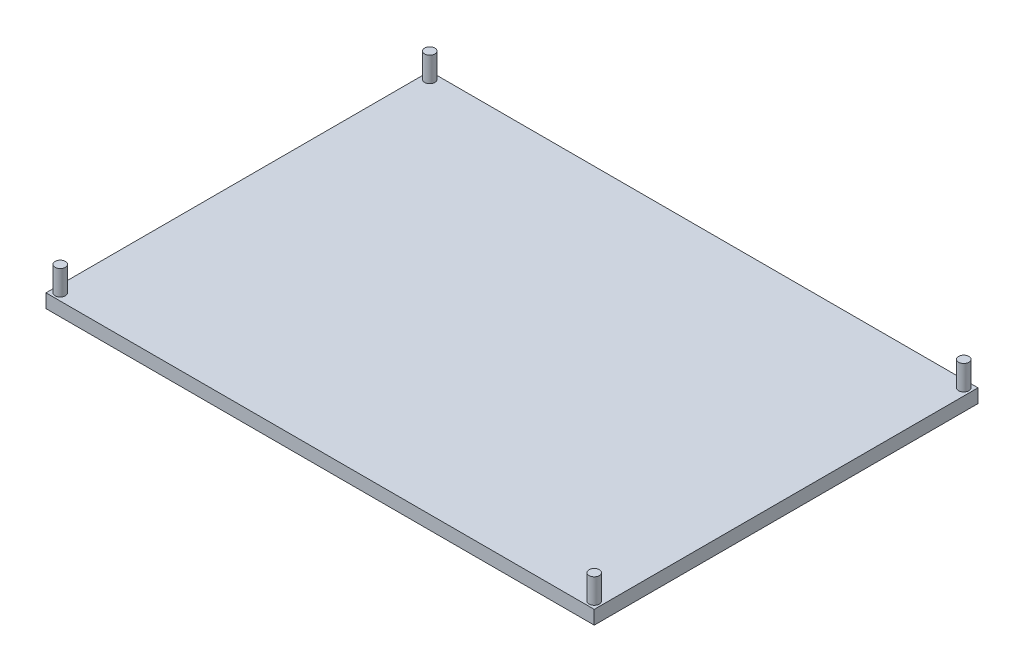
ISO-10303-21;
HEADER;
FILE_DESCRIPTION(('STEP AP214'),'2;1');
FILE_NAME('part.step','',(''),(''),'','','');
FILE_SCHEMA(('AUTOMOTIVE_DESIGN { 1 0 10303 214 1 1 1 1 }'));
ENDSEC;
DATA;
#1=APPLICATION_CONTEXT('core data for automotive mechanical design processes');
#2=APPLICATION_PROTOCOL_DEFINITION('international standard','automotive_design',2000,#1);
#3=PRODUCT_CONTEXT('',#1,'mechanical');
#4=PRODUCT('Part','Part','',(#3));
#5=PRODUCT_RELATED_PRODUCT_CATEGORY('part','',(#4));
#6=PRODUCT_DEFINITION_FORMATION('','',#4);
#7=PRODUCT_DEFINITION_CONTEXT('part definition',#1,'design');
#8=PRODUCT_DEFINITION('design','',#6,#7);
#9=PRODUCT_DEFINITION_SHAPE('','',#8);
#10=(LENGTH_UNIT() NAMED_UNIT(*) SI_UNIT(.MILLI.,.METRE.));
#11=(NAMED_UNIT(*) PLANE_ANGLE_UNIT() SI_UNIT($,.RADIAN.));
#12=(NAMED_UNIT(*) SI_UNIT($,.STERADIAN.) SOLID_ANGLE_UNIT());
#13=UNCERTAINTY_MEASURE_WITH_UNIT(LENGTH_MEASURE(1.E-05),#10,'distance_accuracy_value','');
#14=(GEOMETRIC_REPRESENTATION_CONTEXT(3) GLOBAL_UNCERTAINTY_ASSIGNED_CONTEXT((#13)) GLOBAL_UNIT_ASSIGNED_CONTEXT((#10,
#11,#12)) REPRESENTATION_CONTEXT('',''));
#15=CARTESIAN_POINT('',(0.,0.,0.));
#16=DIRECTION('',(0.,0.,1.));
#17=DIRECTION('',(1.,0.,0.));
#18=AXIS2_PLACEMENT_3D('',#15,#16,#17);
#19=CARTESIAN_POINT('',(127.,6.35,88.9));
#20=DIRECTION('',(-1.,0.,0.));
#21=DIRECTION('',(0.,0.,1.));
#22=AXIS2_PLACEMENT_3D('',#19,#20,#21);
#23=PLANE('',#22);
#24=DIRECTION('',(0.,0.,-1.));
#25=VECTOR('',#24,1.);
#26=CARTESIAN_POINT('',(127.,0.,88.9));
#27=LINE('',#26,#25);
#28=CARTESIAN_POINT('',(127.,0.,88.9));
#29=VERTEX_POINT('',#28);
#30=CARTESIAN_POINT('',(127.,0.,-88.9));
#31=VERTEX_POINT('',#30);
#32=EDGE_CURVE('E99',#29,#31,#27,.T.);
#33=ORIENTED_EDGE('',*,*,#32,.T.);
#34=DIRECTION('',(0.,-1.,0.));
#35=VECTOR('',#34,1.);
#36=CARTESIAN_POINT('',(127.,6.35,-88.9));
#37=LINE('',#36,#35);
#38=CARTESIAN_POINT('',(127.,6.35,-88.9));
#39=VERTEX_POINT('',#38);
#40=EDGE_CURVE('E90',#39,#31,#37,.T.);
#41=ORIENTED_EDGE('',*,*,#40,.F.);
#42=DIRECTION('',(0.,0.,-1.));
#43=VECTOR('',#42,1.);
#44=CARTESIAN_POINT('',(127.,6.35,88.9));
#45=LINE('',#44,#43);
#46=CARTESIAN_POINT('',(127.,6.35,88.9));
#47=VERTEX_POINT('',#46);
#48=EDGE_CURVE('E84',#47,#39,#45,.T.);
#49=ORIENTED_EDGE('',*,*,#48,.F.);
#50=DIRECTION('',(0.,-1.,0.));
#51=VECTOR('',#50,1.);
#52=CARTESIAN_POINT('',(127.,6.35,88.9));
#53=LINE('',#52,#51);
#54=EDGE_CURVE('E95',#47,#29,#53,.T.);
#55=ORIENTED_EDGE('',*,*,#54,.T.);
#56=EDGE_LOOP('',(#33,#41,#49,#55));
#57=FACE_BOUND('',#56,.T.);
#58=ADVANCED_FACE('F32',(#57),#23,.F.);
#59=CARTESIAN_POINT('',(-127.,6.35,-88.9));
#60=DIRECTION('',(0.,0.,1.));
#61=DIRECTION('',(1.,0.,0.));
#62=AXIS2_PLACEMENT_3D('',#59,#60,#61);
#63=PLANE('',#62);
#64=DIRECTION('',(-1.,0.,0.));
#65=VECTOR('',#64,1.);
#66=CARTESIAN_POINT('',(-127.,0.,-88.9));
#67=LINE('',#66,#65);
#68=CARTESIAN_POINT('',(-127.,0.,-88.9));
#69=VERTEX_POINT('',#68);
#70=EDGE_CURVE('E89',#31,#69,#67,.T.);
#71=ORIENTED_EDGE('',*,*,#70,.T.);
#72=DIRECTION('',(0.,-1.,0.));
#73=VECTOR('',#72,1.);
#74=CARTESIAN_POINT('',(-127.,6.35,-88.9));
#75=LINE('',#74,#73);
#76=CARTESIAN_POINT('',(-127.,6.35,-88.9));
#77=VERTEX_POINT('',#76);
#78=EDGE_CURVE('E87',#77,#69,#75,.T.);
#79=ORIENTED_EDGE('',*,*,#78,.F.);
#80=DIRECTION('',(-1.,0.,0.));
#81=VECTOR('',#80,1.);
#82=CARTESIAN_POINT('',(-127.,6.35,-88.9));
#83=LINE('',#82,#81);
#84=EDGE_CURVE('E79',#39,#77,#83,.T.);
#85=ORIENTED_EDGE('',*,*,#84,.F.);
#86=ORIENTED_EDGE('',*,*,#40,.T.);
#87=EDGE_LOOP('',(#71,#79,#85,#86));
#88=FACE_BOUND('',#87,.T.);
#89=ADVANCED_FACE('F88',(#88),#63,.F.);
#90=CARTESIAN_POINT('',(-127.,6.35,88.9));
#91=DIRECTION('',(1.,0.,0.));
#92=DIRECTION('',(0.,0.,-1.));
#93=AXIS2_PLACEMENT_3D('',#90,#91,#92);
#94=PLANE('',#93);
#95=DIRECTION('',(0.,0.,1.));
#96=VECTOR('',#95,1.);
#97=CARTESIAN_POINT('',(-127.,0.,88.9));
#98=LINE('',#97,#96);
#99=CARTESIAN_POINT('',(-127.,0.,88.9));
#100=VERTEX_POINT('',#99);
#101=EDGE_CURVE('E65',#69,#100,#98,.T.);
#102=ORIENTED_EDGE('',*,*,#101,.T.);
#103=DIRECTION('',(0.,-1.,0.));
#104=VECTOR('',#103,1.);
#105=CARTESIAN_POINT('',(-127.,6.35,88.9));
#106=LINE('',#105,#104);
#107=CARTESIAN_POINT('',(-127.,6.35,88.9));
#108=VERTEX_POINT('',#107);
#109=EDGE_CURVE('E91',#108,#100,#106,.T.);
#110=ORIENTED_EDGE('',*,*,#109,.F.);
#111=DIRECTION('',(0.,0.,1.));
#112=VECTOR('',#111,1.);
#113=CARTESIAN_POINT('',(-127.,6.35,88.9));
#114=LINE('',#113,#112);
#115=EDGE_CURVE('E82',#77,#108,#114,.T.);
#116=ORIENTED_EDGE('',*,*,#115,.F.);
#117=ORIENTED_EDGE('',*,*,#78,.T.);
#118=EDGE_LOOP('',(#102,#110,#116,#117));
#119=FACE_BOUND('',#118,.T.);
#120=ADVANCED_FACE('F93',(#119),#94,.F.);
#121=CARTESIAN_POINT('',(-127.,6.35,88.9));
#122=DIRECTION('',(0.,0.,-1.));
#123=DIRECTION('',(-1.,0.,0.));
#124=AXIS2_PLACEMENT_3D('',#121,#122,#123);
#125=PLANE('',#124);
#126=DIRECTION('',(1.,0.,0.));
#127=VECTOR('',#126,1.);
#128=CARTESIAN_POINT('',(-127.,0.,88.9));
#129=LINE('',#128,#127);
#130=EDGE_CURVE('E71',#100,#29,#129,.T.);
#131=ORIENTED_EDGE('',*,*,#130,.T.);
#132=ORIENTED_EDGE('',*,*,#54,.F.);
#133=DIRECTION('',(1.,0.,0.));
#134=VECTOR('',#133,1.);
#135=CARTESIAN_POINT('',(-127.,6.35,88.9));
#136=LINE('',#135,#134);
#137=EDGE_CURVE('E48',#108,#47,#136,.T.);
#138=ORIENTED_EDGE('',*,*,#137,.F.);
#139=ORIENTED_EDGE('',*,*,#109,.T.);
#140=EDGE_LOOP('',(#131,#132,#138,#139));
#141=FACE_BOUND('',#140,.T.);
#142=ADVANCED_FACE('F122',(#141),#125,.F.);
#143=CARTESIAN_POINT('',(0.,6.35,0.));
#144=DIRECTION('',(0.,-1.,0.));
#145=DIRECTION('',(0.,0.,-1.));
#146=AXIS2_PLACEMENT_3D('',#143,#144,#145);
#147=PLANE('',#146);
#148=CARTESIAN_POINT('',(-123.698,6.35,-85.598));
#149=DIRECTION('',(0.,-1.,0.));
#150=DIRECTION('',(0.,0.,-1.));
#151=AXIS2_PLACEMENT_3D('',#148,#149,#150);
#152=CIRCLE('',#151,2.38125);
#153=CARTESIAN_POINT('',(-123.698,6.35,-87.97925));
#154=VERTEX_POINT('',#153);
#155=EDGE_CURVE('E11',#154,#154,#152,.F.);
#156=ORIENTED_EDGE('',*,*,#155,.F.);
#157=EDGE_LOOP('',(#156));
#158=FACE_BOUND('',#157,.T.);
#159=CARTESIAN_POINT('',(123.698,6.35,-85.598));
#160=DIRECTION('',(0.,-1.,0.));
#161=DIRECTION('',(0.,0.,-1.));
#162=AXIS2_PLACEMENT_3D('',#159,#160,#161);
#163=CIRCLE('',#162,2.38125);
#164=CARTESIAN_POINT('',(123.698,6.35,-87.97925));
#165=VERTEX_POINT('',#164);
#166=EDGE_CURVE('E40',#165,#165,#163,.F.);
#167=ORIENTED_EDGE('',*,*,#166,.F.);
#168=EDGE_LOOP('',(#167));
#169=FACE_BOUND('',#168,.T.);
#170=CARTESIAN_POINT('',(123.698,6.35,85.598));
#171=DIRECTION('',(0.,-1.,0.));
#172=DIRECTION('',(0.,0.,-1.));
#173=AXIS2_PLACEMENT_3D('',#170,#171,#172);
#174=CIRCLE('',#173,2.38125);
#175=CARTESIAN_POINT('',(123.698,6.35,83.21675));
#176=VERTEX_POINT('',#175);
#177=EDGE_CURVE('E112',#176,#176,#174,.F.);
#178=ORIENTED_EDGE('',*,*,#177,.F.);
#179=EDGE_LOOP('',(#178));
#180=FACE_BOUND('',#179,.T.);
#181=CARTESIAN_POINT('',(-123.698,6.35,85.598));
#182=DIRECTION('',(0.,-1.,0.));
#183=DIRECTION('',(0.,0.,-1.));
#184=AXIS2_PLACEMENT_3D('',#181,#182,#183);
#185=CIRCLE('',#184,2.38125);
#186=CARTESIAN_POINT('',(-123.698,6.35,83.21675));
#187=VERTEX_POINT('',#186);
#188=EDGE_CURVE('E109',#187,#187,#185,.F.);
#189=ORIENTED_EDGE('',*,*,#188,.F.);
#190=EDGE_LOOP('',(#189));
#191=FACE_BOUND('',#190,.T.);
#192=ORIENTED_EDGE('',*,*,#48,.T.);
#193=ORIENTED_EDGE('',*,*,#84,.T.);
#194=ORIENTED_EDGE('',*,*,#115,.T.);
#195=ORIENTED_EDGE('',*,*,#137,.T.);
#196=EDGE_LOOP('',(#192,#193,#194,#195));
#197=FACE_BOUND('',#196,.T.);
#198=ADVANCED_FACE('F80',(#158,#169,#180,#191,#197),#147,.F.);
#199=CARTESIAN_POINT('',(0.,0.,0.));
#200=DIRECTION('',(0.,-1.,0.));
#201=DIRECTION('',(0.,0.,-1.));
#202=AXIS2_PLACEMENT_3D('',#199,#200,#201);
#203=PLANE('',#202);
#204=ORIENTED_EDGE('',*,*,#32,.F.);
#205=ORIENTED_EDGE('',*,*,#130,.F.);
#206=ORIENTED_EDGE('',*,*,#101,.F.);
#207=ORIENTED_EDGE('',*,*,#70,.F.);
#208=EDGE_LOOP('',(#204,#205,#206,#207));
#209=FACE_BOUND('',#208,.T.);
#210=ADVANCED_FACE('F121',(#209),#203,.T.);
#211=CARTESIAN_POINT('',(-123.698,17.78,85.598));
#212=DIRECTION('',(0.,-1.,0.));
#213=DIRECTION('',(0.,0.,-1.));
#214=AXIS2_PLACEMENT_3D('',#211,#212,#213);
#215=CYLINDRICAL_SURFACE('',#214,2.38125);
#216=CARTESIAN_POINT('',(-123.698,17.78,85.598));
#217=DIRECTION('',(0.,1.,0.));
#218=DIRECTION('',(0.,0.,1.));
#219=AXIS2_PLACEMENT_3D('',#216,#217,#218);
#220=CIRCLE('',#219,2.38125);
#221=CARTESIAN_POINT('',(-123.698,17.78,87.97925));
#222=VERTEX_POINT('',#221);
#223=EDGE_CURVE('E102',#222,#222,#220,.T.);
#224=ORIENTED_EDGE('',*,*,#223,.F.);
#225=EDGE_LOOP('',(#224));
#226=FACE_BOUND('',#225,.T.);
#227=ORIENTED_EDGE('',*,*,#188,.T.);
#228=EDGE_LOOP('',(#227));
#229=FACE_BOUND('',#228,.T.);
#230=ADVANCED_FACE('F129',(#226,#229),#215,.T.);
#231=CARTESIAN_POINT('',(-123.698,17.78,85.598));
#232=DIRECTION('',(0.,1.,0.));
#233=DIRECTION('',(0.,0.,1.));
#234=AXIS2_PLACEMENT_3D('',#231,#232,#233);
#235=PLANE('',#234);
#236=ORIENTED_EDGE('',*,*,#223,.T.);
#237=EDGE_LOOP('',(#236));
#238=FACE_BOUND('',#237,.T.);
#239=ADVANCED_FACE('F131',(#238),#235,.T.);
#240=CARTESIAN_POINT('',(123.698,17.78,85.598));
#241=DIRECTION('',(0.,-1.,0.));
#242=DIRECTION('',(0.,0.,-1.));
#243=AXIS2_PLACEMENT_3D('',#240,#241,#242);
#244=CYLINDRICAL_SURFACE('',#243,2.38125);
#245=CARTESIAN_POINT('',(123.698,17.78,85.598));
#246=DIRECTION('',(0.,1.,0.));
#247=DIRECTION('',(0.,0.,1.));
#248=AXIS2_PLACEMENT_3D('',#245,#246,#247);
#249=CIRCLE('',#248,2.38125);
#250=CARTESIAN_POINT('',(123.698,17.78,87.97925));
#251=VERTEX_POINT('',#250);
#252=EDGE_CURVE('E260',#251,#251,#249,.T.);
#253=ORIENTED_EDGE('',*,*,#252,.F.);
#254=EDGE_LOOP('',(#253));
#255=FACE_BOUND('',#254,.T.);
#256=ORIENTED_EDGE('',*,*,#177,.T.);
#257=EDGE_LOOP('',(#256));
#258=FACE_BOUND('',#257,.T.);
#259=ADVANCED_FACE('F138',(#255,#258),#244,.T.);
#260=CARTESIAN_POINT('',(123.698,17.78,85.598));
#261=DIRECTION('',(0.,1.,0.));
#262=DIRECTION('',(0.,0.,1.));
#263=AXIS2_PLACEMENT_3D('',#260,#261,#262);
#264=PLANE('',#263);
#265=ORIENTED_EDGE('',*,*,#252,.T.);
#266=EDGE_LOOP('',(#265));
#267=FACE_BOUND('',#266,.T.);
#268=ADVANCED_FACE('F201',(#267),#264,.T.);
#269=CARTESIAN_POINT('',(123.698,17.78,-85.598));
#270=DIRECTION('',(0.,-1.,0.));
#271=DIRECTION('',(0.,0.,-1.));
#272=AXIS2_PLACEMENT_3D('',#269,#270,#271);
#273=CYLINDRICAL_SURFACE('',#272,2.38125);
#274=CARTESIAN_POINT('',(123.698,17.78,-85.598));
#275=DIRECTION('',(0.,1.,0.));
#276=DIRECTION('',(0.,0.,1.));
#277=AXIS2_PLACEMENT_3D('',#274,#275,#276);
#278=CIRCLE('',#277,2.38125);
#279=CARTESIAN_POINT('',(123.698,17.78,-83.21675));
#280=VERTEX_POINT('',#279);
#281=EDGE_CURVE('E257',#280,#280,#278,.T.);
#282=ORIENTED_EDGE('',*,*,#281,.F.);
#283=EDGE_LOOP('',(#282));
#284=FACE_BOUND('',#283,.T.);
#285=ORIENTED_EDGE('',*,*,#166,.T.);
#286=EDGE_LOOP('',(#285));
#287=FACE_BOUND('',#286,.T.);
#288=ADVANCED_FACE('F117',(#284,#287),#273,.T.);
#289=CARTESIAN_POINT('',(123.698,17.78,-85.598));
#290=DIRECTION('',(0.,1.,0.));
#291=DIRECTION('',(0.,0.,1.));
#292=AXIS2_PLACEMENT_3D('',#289,#290,#291);
#293=PLANE('',#292);
#294=ORIENTED_EDGE('',*,*,#281,.T.);
#295=EDGE_LOOP('',(#294));
#296=FACE_BOUND('',#295,.T.);
#297=ADVANCED_FACE('F218',(#296),#293,.T.);
#298=CARTESIAN_POINT('',(-123.698,17.78,-85.598));
#299=DIRECTION('',(0.,-1.,0.));
#300=DIRECTION('',(0.,0.,-1.));
#301=AXIS2_PLACEMENT_3D('',#298,#299,#300);
#302=CYLINDRICAL_SURFACE('',#301,2.38125);
#303=CARTESIAN_POINT('',(-123.698,17.78,-85.598));
#304=DIRECTION('',(0.,1.,0.));
#305=DIRECTION('',(0.,0.,1.));
#306=AXIS2_PLACEMENT_3D('',#303,#304,#305);
#307=CIRCLE('',#306,2.38125);
#308=CARTESIAN_POINT('',(-123.698,17.78,-83.21675));
#309=VERTEX_POINT('',#308);
#310=EDGE_CURVE('E256',#309,#309,#307,.T.);
#311=ORIENTED_EDGE('',*,*,#310,.F.);
#312=EDGE_LOOP('',(#311));
#313=FACE_BOUND('',#312,.T.);
#314=ORIENTED_EDGE('',*,*,#155,.T.);
#315=EDGE_LOOP('',(#314));
#316=FACE_BOUND('',#315,.T.);
#317=ADVANCED_FACE('F227',(#313,#316),#302,.T.);
#318=CARTESIAN_POINT('',(-123.698,17.78,-85.598));
#319=DIRECTION('',(0.,1.,0.));
#320=DIRECTION('',(0.,0.,1.));
#321=AXIS2_PLACEMENT_3D('',#318,#319,#320);
#322=PLANE('',#321);
#323=ORIENTED_EDGE('',*,*,#310,.T.);
#324=EDGE_LOOP('',(#323));
#325=FACE_BOUND('',#324,.T.);
#326=ADVANCED_FACE('F236',(#325),#322,.T.);
#327=CLOSED_SHELL('',(#58,#89,#120,#142,#198,#210,#230,#239,#259,#268,#288,#297,#317,#326));
#328=MANIFOLD_SOLID_BREP('B2',#327);
#329=ADVANCED_BREP_SHAPE_REPRESENTATION('',(#18,#328),#14);
#330=SHAPE_DEFINITION_REPRESENTATION(#9,#329);
ENDSEC;
END-ISO-10303-21;
